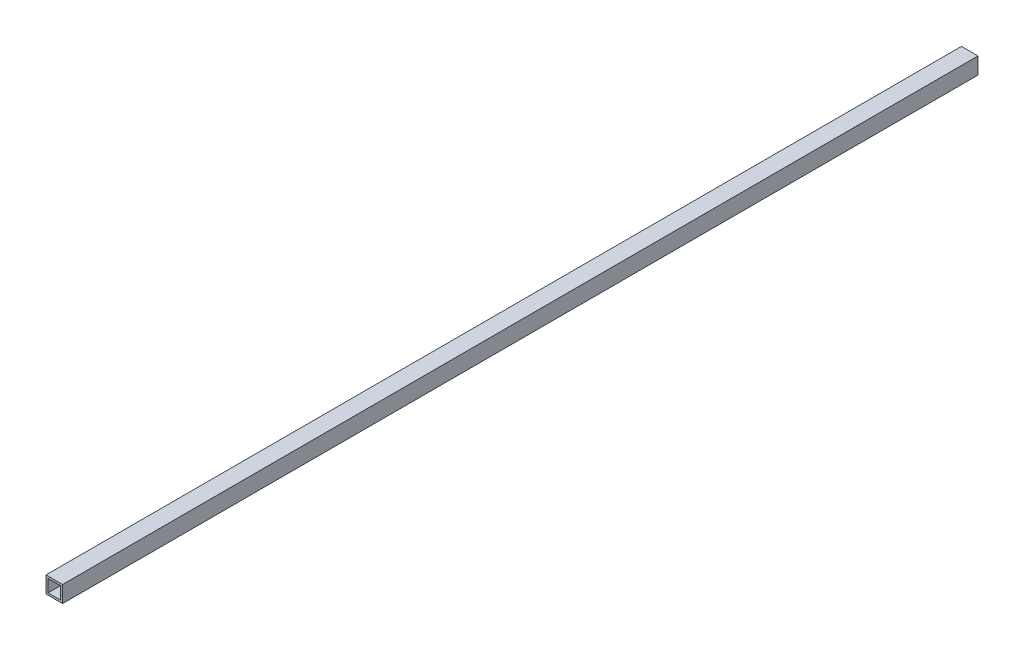
ISO-10303-21;
HEADER;
FILE_DESCRIPTION(('STEP AP214'),'2;1');
FILE_NAME('part.step','',(''),(''),'','','');
FILE_SCHEMA(('AUTOMOTIVE_DESIGN { 1 0 10303 214 1 1 1 1 }'));
ENDSEC;
DATA;
#1=APPLICATION_CONTEXT('core data for automotive mechanical design processes');
#2=APPLICATION_PROTOCOL_DEFINITION('international standard','automotive_design',2000,#1);
#3=PRODUCT_CONTEXT('',#1,'mechanical');
#4=PRODUCT('Part','Part','',(#3));
#5=PRODUCT_RELATED_PRODUCT_CATEGORY('part','',(#4));
#6=PRODUCT_DEFINITION_FORMATION('','',#4);
#7=PRODUCT_DEFINITION_CONTEXT('part definition',#1,'design');
#8=PRODUCT_DEFINITION('design','',#6,#7);
#9=PRODUCT_DEFINITION_SHAPE('','',#8);
#10=(LENGTH_UNIT() NAMED_UNIT(*) SI_UNIT(.MILLI.,.METRE.));
#11=(NAMED_UNIT(*) PLANE_ANGLE_UNIT() SI_UNIT($,.RADIAN.));
#12=(NAMED_UNIT(*) SI_UNIT($,.STERADIAN.) SOLID_ANGLE_UNIT());
#13=UNCERTAINTY_MEASURE_WITH_UNIT(LENGTH_MEASURE(1.E-05),#10,'distance_accuracy_value','');
#14=(GEOMETRIC_REPRESENTATION_CONTEXT(3) GLOBAL_UNCERTAINTY_ASSIGNED_CONTEXT((#13)) GLOBAL_UNIT_ASSIGNED_CONTEXT((#10,
#11,#12)) REPRESENTATION_CONTEXT('',''));
#15=CARTESIAN_POINT('',(0.,0.,0.));
#16=DIRECTION('',(0.,0.,1.));
#17=DIRECTION('',(1.,0.,0.));
#18=AXIS2_PLACEMENT_3D('',#15,#16,#17);
#19=CARTESIAN_POINT('',(0.,0.,350.8375));
#20=DIRECTION('',(0.,0.,-1.));
#21=DIRECTION('',(-1.,0.,0.));
#22=AXIS2_PLACEMENT_3D('',#19,#20,#21);
#23=PLANE('',#22);
#24=DIRECTION('',(0.,1.,0.));
#25=VECTOR('',#24,1.);
#26=CARTESIAN_POINT('',(6.35,-6.35,350.8375));
#27=LINE('',#26,#25);
#28=CARTESIAN_POINT('',(6.35,-6.35,350.8375));
#29=VERTEX_POINT('',#28);
#30=CARTESIAN_POINT('',(6.35,6.35,350.8375));
#31=VERTEX_POINT('',#30);
#32=EDGE_CURVE('E134',#29,#31,#27,.T.);
#33=ORIENTED_EDGE('',*,*,#32,.T.);
#34=DIRECTION('',(-1.,0.,0.));
#35=VECTOR('',#34,1.);
#36=CARTESIAN_POINT('',(-6.35,6.35,350.8375));
#37=LINE('',#36,#35);
#38=CARTESIAN_POINT('',(-6.35,6.35,350.8375));
#39=VERTEX_POINT('',#38);
#40=EDGE_CURVE('E137',#31,#39,#37,.T.);
#41=ORIENTED_EDGE('',*,*,#40,.T.);
#42=DIRECTION('',(0.,-1.,0.));
#43=VECTOR('',#42,1.);
#44=CARTESIAN_POINT('',(-6.35,-6.35,350.8375));
#45=LINE('',#44,#43);
#46=CARTESIAN_POINT('',(-6.35,-6.35,350.8375));
#47=VERTEX_POINT('',#46);
#48=EDGE_CURVE('E140',#39,#47,#45,.T.);
#49=ORIENTED_EDGE('',*,*,#48,.T.);
#50=DIRECTION('',(1.,0.,0.));
#51=VECTOR('',#50,1.);
#52=CARTESIAN_POINT('',(-6.35,-6.35,350.8375));
#53=LINE('',#52,#51);
#54=EDGE_CURVE('E142',#47,#29,#53,.T.);
#55=ORIENTED_EDGE('',*,*,#54,.T.);
#56=EDGE_LOOP('',(#33,#41,#49,#55));
#57=FACE_BOUND('',#56,.T.);
#58=DIRECTION('',(0.,-1.,0.));
#59=VECTOR('',#58,1.);
#60=CARTESIAN_POINT('',(-4.7625,-4.7625,350.8375));
#61=LINE('',#60,#59);
#62=CARTESIAN_POINT('',(-4.7625,4.7625,350.8375));
#63=VERTEX_POINT('',#62);
#64=CARTESIAN_POINT('',(-4.7625,-4.7625,350.8375));
#65=VERTEX_POINT('',#64);
#66=EDGE_CURVE('E98',#63,#65,#61,.T.);
#67=ORIENTED_EDGE('',*,*,#66,.F.);
#68=DIRECTION('',(-1.,0.,0.));
#69=VECTOR('',#68,1.);
#70=CARTESIAN_POINT('',(-4.7625,4.7625,350.8375));
#71=LINE('',#70,#69);
#72=CARTESIAN_POINT('',(4.7625,4.7625,350.8375));
#73=VERTEX_POINT('',#72);
#74=EDGE_CURVE('E120',#73,#63,#71,.T.);
#75=ORIENTED_EDGE('',*,*,#74,.F.);
#76=DIRECTION('',(0.,1.,0.));
#77=VECTOR('',#76,1.);
#78=CARTESIAN_POINT('',(4.7625,-4.7625,350.8375));
#79=LINE('',#78,#77);
#80=CARTESIAN_POINT('',(4.7625,-4.7625,350.8375));
#81=VERTEX_POINT('',#80);
#82=EDGE_CURVE('E118',#81,#73,#79,.T.);
#83=ORIENTED_EDGE('',*,*,#82,.F.);
#84=DIRECTION('',(1.,0.,0.));
#85=VECTOR('',#84,1.);
#86=CARTESIAN_POINT('',(-4.7625,-4.7625,350.8375));
#87=LINE('',#86,#85);
#88=EDGE_CURVE('E106',#65,#81,#87,.T.);
#89=ORIENTED_EDGE('',*,*,#88,.F.);
#90=EDGE_LOOP('',(#67,#75,#83,#89));
#91=FACE_BOUND('',#90,.T.);
#92=ADVANCED_FACE('F33',(#57,#91),#23,.F.);
#93=CARTESIAN_POINT('',(0.,0.,-350.8375));
#94=DIRECTION('',(0.,0.,-1.));
#95=DIRECTION('',(-1.,0.,0.));
#96=AXIS2_PLACEMENT_3D('',#93,#94,#95);
#97=PLANE('',#96);
#98=DIRECTION('',(0.,1.,0.));
#99=VECTOR('',#98,1.);
#100=CARTESIAN_POINT('',(6.35,-6.35,-350.8375));
#101=LINE('',#100,#99);
#102=CARTESIAN_POINT('',(6.35,-6.35,-350.8375));
#103=VERTEX_POINT('',#102);
#104=CARTESIAN_POINT('',(6.35,6.35,-350.8375));
#105=VERTEX_POINT('',#104);
#106=EDGE_CURVE('E114',#103,#105,#101,.T.);
#107=ORIENTED_EDGE('',*,*,#106,.F.);
#108=DIRECTION('',(1.,0.,0.));
#109=VECTOR('',#108,1.);
#110=CARTESIAN_POINT('',(-6.35,-6.35,-350.8375));
#111=LINE('',#110,#109);
#112=CARTESIAN_POINT('',(-6.35,-6.35,-350.8375));
#113=VERTEX_POINT('',#112);
#114=EDGE_CURVE('E138',#113,#103,#111,.T.);
#115=ORIENTED_EDGE('',*,*,#114,.F.);
#116=DIRECTION('',(0.,-1.,0.));
#117=VECTOR('',#116,1.);
#118=CARTESIAN_POINT('',(-6.35,-6.35,-350.8375));
#119=LINE('',#118,#117);
#120=CARTESIAN_POINT('',(-6.35,6.35,-350.8375));
#121=VERTEX_POINT('',#120);
#122=EDGE_CURVE('E149',#121,#113,#119,.T.);
#123=ORIENTED_EDGE('',*,*,#122,.F.);
#124=DIRECTION('',(-1.,0.,0.));
#125=VECTOR('',#124,1.);
#126=CARTESIAN_POINT('',(-6.35,6.35,-350.8375));
#127=LINE('',#126,#125);
#128=EDGE_CURVE('E147',#105,#121,#127,.T.);
#129=ORIENTED_EDGE('',*,*,#128,.F.);
#130=EDGE_LOOP('',(#107,#115,#123,#129));
#131=FACE_BOUND('',#130,.T.);
#132=DIRECTION('',(-1.,0.,0.));
#133=VECTOR('',#132,1.);
#134=CARTESIAN_POINT('',(-4.7625,4.7625,-350.8375));
#135=LINE('',#134,#133);
#136=CARTESIAN_POINT('',(4.7625,4.7625,-350.8375));
#137=VERTEX_POINT('',#136);
#138=CARTESIAN_POINT('',(-4.7625,4.7625,-350.8375));
#139=VERTEX_POINT('',#138);
#140=EDGE_CURVE('E107',#137,#139,#135,.T.);
#141=ORIENTED_EDGE('',*,*,#140,.T.);
#142=DIRECTION('',(0.,-1.,0.));
#143=VECTOR('',#142,1.);
#144=CARTESIAN_POINT('',(-4.7625,-4.7625,-350.8375));
#145=LINE('',#144,#143);
#146=CARTESIAN_POINT('',(-4.7625,-4.7625,-350.8375));
#147=VERTEX_POINT('',#146);
#148=EDGE_CURVE('E56',#139,#147,#145,.T.);
#149=ORIENTED_EDGE('',*,*,#148,.T.);
#150=DIRECTION('',(1.,0.,0.));
#151=VECTOR('',#150,1.);
#152=CARTESIAN_POINT('',(-4.7625,-4.7625,-350.8375));
#153=LINE('',#152,#151);
#154=CARTESIAN_POINT('',(4.7625,-4.7625,-350.8375));
#155=VERTEX_POINT('',#154);
#156=EDGE_CURVE('E113',#147,#155,#153,.T.);
#157=ORIENTED_EDGE('',*,*,#156,.T.);
#158=DIRECTION('',(0.,1.,0.));
#159=VECTOR('',#158,1.);
#160=CARTESIAN_POINT('',(4.7625,-4.7625,-350.8375));
#161=LINE('',#160,#159);
#162=EDGE_CURVE('E126',#155,#137,#161,.T.);
#163=ORIENTED_EDGE('',*,*,#162,.T.);
#164=EDGE_LOOP('',(#141,#149,#157,#163));
#165=FACE_BOUND('',#164,.T.);
#166=ADVANCED_FACE('F167',(#131,#165),#97,.T.);
#167=CARTESIAN_POINT('',(6.35,-6.35,350.8375));
#168=DIRECTION('',(-1.,0.,0.));
#169=DIRECTION('',(0.,0.,1.));
#170=AXIS2_PLACEMENT_3D('',#167,#168,#169);
#171=PLANE('',#170);
#172=ORIENTED_EDGE('',*,*,#106,.T.);
#173=DIRECTION('',(0.,0.,-1.));
#174=VECTOR('',#173,1.);
#175=CARTESIAN_POINT('',(6.35,6.35,350.8375));
#176=LINE('',#175,#174);
#177=EDGE_CURVE('E11',#31,#105,#176,.T.);
#178=ORIENTED_EDGE('',*,*,#177,.F.);
#179=ORIENTED_EDGE('',*,*,#32,.F.);
#180=DIRECTION('',(0.,0.,-1.));
#181=VECTOR('',#180,1.);
#182=CARTESIAN_POINT('',(6.35,-6.35,350.8375));
#183=LINE('',#182,#181);
#184=EDGE_CURVE('E144',#29,#103,#183,.T.);
#185=ORIENTED_EDGE('',*,*,#184,.T.);
#186=EDGE_LOOP('',(#172,#178,#179,#185));
#187=FACE_BOUND('',#186,.T.);
#188=ADVANCED_FACE('F35',(#187),#171,.F.);
#189=CARTESIAN_POINT('',(-6.35,6.35,350.8375));
#190=DIRECTION('',(0.,-1.,0.));
#191=DIRECTION('',(0.,0.,-1.));
#192=AXIS2_PLACEMENT_3D('',#189,#190,#191);
#193=PLANE('',#192);
#194=ORIENTED_EDGE('',*,*,#128,.T.);
#195=DIRECTION('',(0.,0.,-1.));
#196=VECTOR('',#195,1.);
#197=CARTESIAN_POINT('',(-6.35,6.35,350.8375));
#198=LINE('',#197,#196);
#199=EDGE_CURVE('E41',#39,#121,#198,.T.);
#200=ORIENTED_EDGE('',*,*,#199,.F.);
#201=ORIENTED_EDGE('',*,*,#40,.F.);
#202=ORIENTED_EDGE('',*,*,#177,.T.);
#203=EDGE_LOOP('',(#194,#200,#201,#202));
#204=FACE_BOUND('',#203,.T.);
#205=ADVANCED_FACE('F177',(#204),#193,.F.);
#206=CARTESIAN_POINT('',(-6.35,-6.35,350.8375));
#207=DIRECTION('',(1.,0.,0.));
#208=DIRECTION('',(0.,0.,-1.));
#209=AXIS2_PLACEMENT_3D('',#206,#207,#208);
#210=PLANE('',#209);
#211=ORIENTED_EDGE('',*,*,#122,.T.);
#212=DIRECTION('',(0.,0.,-1.));
#213=VECTOR('',#212,1.);
#214=CARTESIAN_POINT('',(-6.35,-6.35,350.8375));
#215=LINE('',#214,#213);
#216=EDGE_CURVE('E154',#47,#113,#215,.T.);
#217=ORIENTED_EDGE('',*,*,#216,.F.);
#218=ORIENTED_EDGE('',*,*,#48,.F.);
#219=ORIENTED_EDGE('',*,*,#199,.T.);
#220=EDGE_LOOP('',(#211,#217,#218,#219));
#221=FACE_BOUND('',#220,.T.);
#222=ADVANCED_FACE('F161',(#221),#210,.F.);
#223=CARTESIAN_POINT('',(-6.35,-6.35,350.8375));
#224=DIRECTION('',(0.,1.,0.));
#225=DIRECTION('',(0.,0.,1.));
#226=AXIS2_PLACEMENT_3D('',#223,#224,#225);
#227=PLANE('',#226);
#228=ORIENTED_EDGE('',*,*,#114,.T.);
#229=ORIENTED_EDGE('',*,*,#184,.F.);
#230=ORIENTED_EDGE('',*,*,#54,.F.);
#231=ORIENTED_EDGE('',*,*,#216,.T.);
#232=EDGE_LOOP('',(#228,#229,#230,#231));
#233=FACE_BOUND('',#232,.T.);
#234=ADVANCED_FACE('F171',(#233),#227,.F.);
#235=CARTESIAN_POINT('',(-4.7625,-4.7625,350.8375));
#236=DIRECTION('',(1.,0.,0.));
#237=DIRECTION('',(0.,0.,-1.));
#238=AXIS2_PLACEMENT_3D('',#235,#236,#237);
#239=PLANE('',#238);
#240=ORIENTED_EDGE('',*,*,#148,.F.);
#241=DIRECTION('',(0.,0.,-1.));
#242=VECTOR('',#241,1.);
#243=CARTESIAN_POINT('',(-4.7625,4.7625,350.8375));
#244=LINE('',#243,#242);
#245=EDGE_CURVE('E102',#63,#139,#244,.T.);
#246=ORIENTED_EDGE('',*,*,#245,.F.);
#247=ORIENTED_EDGE('',*,*,#66,.T.);
#248=DIRECTION('',(0.,0.,-1.));
#249=VECTOR('',#248,1.);
#250=CARTESIAN_POINT('',(-4.7625,-4.7625,350.8375));
#251=LINE('',#250,#249);
#252=EDGE_CURVE('E101',#65,#147,#251,.T.);
#253=ORIENTED_EDGE('',*,*,#252,.T.);
#254=EDGE_LOOP('',(#240,#246,#247,#253));
#255=FACE_BOUND('',#254,.T.);
#256=ADVANCED_FACE('F100',(#255),#239,.T.);
#257=CARTESIAN_POINT('',(-4.7625,-4.7625,350.8375));
#258=DIRECTION('',(0.,1.,0.));
#259=DIRECTION('',(0.,0.,1.));
#260=AXIS2_PLACEMENT_3D('',#257,#258,#259);
#261=PLANE('',#260);
#262=ORIENTED_EDGE('',*,*,#156,.F.);
#263=ORIENTED_EDGE('',*,*,#252,.F.);
#264=ORIENTED_EDGE('',*,*,#88,.T.);
#265=DIRECTION('',(0.,0.,-1.));
#266=VECTOR('',#265,1.);
#267=CARTESIAN_POINT('',(4.7625,-4.7625,350.8375));
#268=LINE('',#267,#266);
#269=EDGE_CURVE('E115',#81,#155,#268,.T.);
#270=ORIENTED_EDGE('',*,*,#269,.T.);
#271=EDGE_LOOP('',(#262,#263,#264,#270));
#272=FACE_BOUND('',#271,.T.);
#273=ADVANCED_FACE('F110',(#272),#261,.T.);
#274=CARTESIAN_POINT('',(4.7625,-4.7625,350.8375));
#275=DIRECTION('',(-1.,0.,0.));
#276=DIRECTION('',(0.,0.,1.));
#277=AXIS2_PLACEMENT_3D('',#274,#275,#276);
#278=PLANE('',#277);
#279=ORIENTED_EDGE('',*,*,#162,.F.);
#280=ORIENTED_EDGE('',*,*,#269,.F.);
#281=ORIENTED_EDGE('',*,*,#82,.T.);
#282=DIRECTION('',(0.,0.,-1.));
#283=VECTOR('',#282,1.);
#284=CARTESIAN_POINT('',(4.7625,4.7625,350.8375));
#285=LINE('',#284,#283);
#286=EDGE_CURVE('E48',#73,#137,#285,.T.);
#287=ORIENTED_EDGE('',*,*,#286,.T.);
#288=EDGE_LOOP('',(#279,#280,#281,#287));
#289=FACE_BOUND('',#288,.T.);
#290=ADVANCED_FACE('F200',(#289),#278,.T.);
#291=CARTESIAN_POINT('',(-4.7625,4.7625,350.8375));
#292=DIRECTION('',(0.,-1.,0.));
#293=DIRECTION('',(1.,0.,0.));
#294=AXIS2_PLACEMENT_3D('',#291,#292,#293);
#295=PLANE('',#294);
#296=ORIENTED_EDGE('',*,*,#140,.F.);
#297=ORIENTED_EDGE('',*,*,#286,.F.);
#298=ORIENTED_EDGE('',*,*,#74,.T.);
#299=ORIENTED_EDGE('',*,*,#245,.T.);
#300=EDGE_LOOP('',(#296,#297,#298,#299));
#301=FACE_BOUND('',#300,.T.);
#302=ADVANCED_FACE('F204',(#301),#295,.T.);
#303=CLOSED_SHELL('',(#92,#166,#188,#205,#222,#234,#256,#273,#290,#302));
#304=MANIFOLD_SOLID_BREP('B2',#303);
#305=ADVANCED_BREP_SHAPE_REPRESENTATION('',(#18,#304),#14);
#306=SHAPE_DEFINITION_REPRESENTATION(#9,#305);
ENDSEC;
END-ISO-10303-21;
